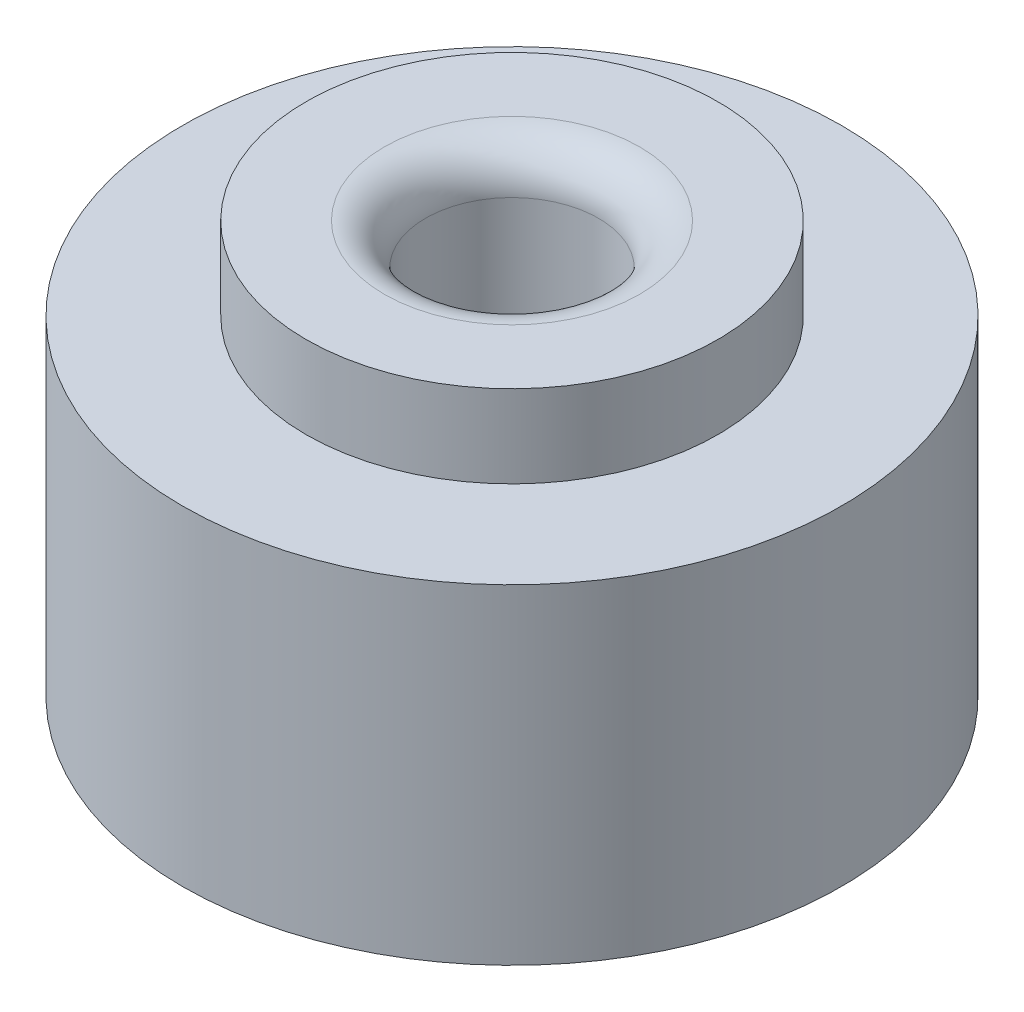
ISO-10303-21;
HEADER;
FILE_DESCRIPTION(('STEP AP214'),'2;1');
FILE_NAME('part.step','',(''),(''),'','','');
FILE_SCHEMA(('AUTOMOTIVE_DESIGN { 1 0 10303 214 1 1 1 1 }'));
ENDSEC;
DATA;
#1=APPLICATION_CONTEXT('core data for automotive mechanical design processes');
#2=APPLICATION_PROTOCOL_DEFINITION('international standard','automotive_design',2000,#1);
#3=PRODUCT_CONTEXT('',#1,'mechanical');
#4=PRODUCT('Part','Part','',(#3));
#5=PRODUCT_RELATED_PRODUCT_CATEGORY('part','',(#4));
#6=PRODUCT_DEFINITION_FORMATION('','',#4);
#7=PRODUCT_DEFINITION_CONTEXT('part definition',#1,'design');
#8=PRODUCT_DEFINITION('design','',#6,#7);
#9=PRODUCT_DEFINITION_SHAPE('','',#8);
#10=(LENGTH_UNIT() NAMED_UNIT(*) SI_UNIT(.MILLI.,.METRE.));
#11=(NAMED_UNIT(*) PLANE_ANGLE_UNIT() SI_UNIT($,.RADIAN.));
#12=(NAMED_UNIT(*) SI_UNIT($,.STERADIAN.) SOLID_ANGLE_UNIT());
#13=UNCERTAINTY_MEASURE_WITH_UNIT(LENGTH_MEASURE(1.E-05),#10,'distance_accuracy_value','');
#14=(GEOMETRIC_REPRESENTATION_CONTEXT(3) GLOBAL_UNCERTAINTY_ASSIGNED_CONTEXT((#13)) GLOBAL_UNIT_ASSIGNED_CONTEXT((#10,
#11,#12)) REPRESENTATION_CONTEXT('',''));
#15=CARTESIAN_POINT('',(0.,0.,0.));
#16=DIRECTION('',(0.,0.,1.));
#17=DIRECTION('',(1.,0.,0.));
#18=AXIS2_PLACEMENT_3D('',#15,#16,#17);
#19=CARTESIAN_POINT('',(0.,4.,0.));
#20=DIRECTION('',(0.,1.,0.));
#21=DIRECTION('',(0.,0.,1.));
#22=AXIS2_PLACEMENT_3D('',#19,#20,#21);
#23=PLANE('',#22);
#24=CARTESIAN_POINT('',(0.,4.,0.));
#25=DIRECTION('',(0.,1.,0.));
#26=DIRECTION('',(0.,0.,1.));
#27=AXIS2_PLACEMENT_3D('',#24,#25,#26);
#28=CIRCLE('',#27,2.5);
#29=CARTESIAN_POINT('',(0.,4.,2.5));
#30=VERTEX_POINT('',#29);
#31=EDGE_CURVE('E57',#30,#30,#28,.T.);
#32=ORIENTED_EDGE('',*,*,#31,.F.);
#33=EDGE_LOOP('',(#32));
#34=FACE_BOUND('',#33,.T.);
#35=CARTESIAN_POINT('',(0.,4.,0.));
#36=DIRECTION('',(0.,1.,0.));
#37=DIRECTION('',(0.,0.,1.));
#38=AXIS2_PLACEMENT_3D('',#35,#36,#37);
#39=CIRCLE('',#38,4.);
#40=CARTESIAN_POINT('',(0.,4.,4.));
#41=VERTEX_POINT('',#40);
#42=EDGE_CURVE('E50',#41,#41,#39,.T.);
#43=ORIENTED_EDGE('',*,*,#42,.T.);
#44=EDGE_LOOP('',(#43));
#45=FACE_BOUND('',#44,.T.);
#46=ADVANCED_FACE('F30',(#34,#45),#23,.T.);
#47=CARTESIAN_POINT('',(0.,0.,0.));
#48=DIRECTION('',(0.,1.,0.));
#49=DIRECTION('',(0.,0.,1.));
#50=AXIS2_PLACEMENT_3D('',#47,#48,#49);
#51=PLANE('',#50);
#52=CARTESIAN_POINT('',(0.,0.,0.));
#53=DIRECTION('',(0.,1.,0.));
#54=DIRECTION('',(0.,0.,1.));
#55=AXIS2_PLACEMENT_3D('',#52,#53,#54);
#56=CIRCLE('',#55,1.55);
#57=CARTESIAN_POINT('',(0.,0.,1.55));
#58=VERTEX_POINT('',#57);
#59=EDGE_CURVE('E45',#58,#58,#56,.T.);
#60=ORIENTED_EDGE('',*,*,#59,.T.);
#61=EDGE_LOOP('',(#60));
#62=FACE_BOUND('',#61,.T.);
#63=CARTESIAN_POINT('',(0.,0.,0.));
#64=DIRECTION('',(0.,1.,0.));
#65=DIRECTION('',(0.,0.,1.));
#66=AXIS2_PLACEMENT_3D('',#63,#64,#65);
#67=CIRCLE('',#66,4.);
#68=CARTESIAN_POINT('',(0.,0.,4.));
#69=VERTEX_POINT('',#68);
#70=EDGE_CURVE('E51',#69,#69,#67,.T.);
#71=ORIENTED_EDGE('',*,*,#70,.F.);
#72=EDGE_LOOP('',(#71));
#73=FACE_BOUND('',#72,.T.);
#74=ADVANCED_FACE('F74',(#62,#73),#51,.F.);
#75=CARTESIAN_POINT('',(0.,4.,0.));
#76=DIRECTION('',(0.,-1.,0.));
#77=DIRECTION('',(0.,0.,-1.));
#78=AXIS2_PLACEMENT_3D('',#75,#76,#77);
#79=CYLINDRICAL_SURFACE('',#78,4.);
#80=ORIENTED_EDGE('',*,*,#42,.F.);
#81=EDGE_LOOP('',(#80));
#82=FACE_BOUND('',#81,.T.);
#83=ORIENTED_EDGE('',*,*,#70,.T.);
#84=EDGE_LOOP('',(#83));
#85=FACE_BOUND('',#84,.T.);
#86=ADVANCED_FACE('F78',(#82,#85),#79,.T.);
#87=CARTESIAN_POINT('',(0.,4.,0.));
#88=DIRECTION('',(0.,-1.,0.));
#89=DIRECTION('',(0.,0.,-1.));
#90=AXIS2_PLACEMENT_3D('',#87,#88,#89);
#91=CYLINDRICAL_SURFACE('',#90,1.05);
#92=CARTESIAN_POINT('',(0.,0.5,0.));
#93=DIRECTION('',(0.,1.,0.));
#94=DIRECTION('',(0.,0.,1.));
#95=AXIS2_PLACEMENT_3D('',#92,#93,#94);
#96=CIRCLE('',#95,1.05);
#97=CARTESIAN_POINT('',(0.,0.5,1.05));
#98=VERTEX_POINT('',#97);
#99=EDGE_CURVE('E37',#98,#98,#96,.F.);
#100=ORIENTED_EDGE('',*,*,#99,.T.);
#101=EDGE_LOOP('',(#100));
#102=FACE_BOUND('',#101,.T.);
#103=CARTESIAN_POINT('',(0.,4.5,0.));
#104=DIRECTION('',(0.,1.,0.));
#105=DIRECTION('',(0.,0.,1.));
#106=AXIS2_PLACEMENT_3D('',#103,#104,#105);
#107=CIRCLE('',#106,1.05);
#108=CARTESIAN_POINT('',(0.,4.5,1.05));
#109=VERTEX_POINT('',#108);
#110=EDGE_CURVE('E41',#109,#109,#107,.T.);
#111=ORIENTED_EDGE('',*,*,#110,.T.);
#112=EDGE_LOOP('',(#111));
#113=FACE_BOUND('',#112,.T.);
#114=ADVANCED_FACE('F68',(#102,#113),#91,.F.);
#115=CARTESIAN_POINT('',(0.,5.,0.));
#116=DIRECTION('',(0.,-1.,0.));
#117=DIRECTION('',(0.,0.,-1.));
#118=AXIS2_PLACEMENT_3D('',#115,#116,#117);
#119=CYLINDRICAL_SURFACE('',#118,2.5);
#120=CARTESIAN_POINT('',(0.,5.,0.));
#121=DIRECTION('',(0.,1.,0.));
#122=DIRECTION('',(0.,0.,1.));
#123=AXIS2_PLACEMENT_3D('',#120,#121,#122);
#124=CIRCLE('',#123,2.5);
#125=CARTESIAN_POINT('',(0.,5.,2.5));
#126=VERTEX_POINT('',#125);
#127=EDGE_CURVE('E54',#126,#126,#124,.T.);
#128=ORIENTED_EDGE('',*,*,#127,.F.);
#129=EDGE_LOOP('',(#128));
#130=FACE_BOUND('',#129,.T.);
#131=ORIENTED_EDGE('',*,*,#31,.T.);
#132=EDGE_LOOP('',(#131));
#133=FACE_BOUND('',#132,.T.);
#134=ADVANCED_FACE('F65',(#130,#133),#119,.T.);
#135=CARTESIAN_POINT('',(0.,5.,0.));
#136=DIRECTION('',(0.,1.,0.));
#137=DIRECTION('',(0.,0.,1.));
#138=AXIS2_PLACEMENT_3D('',#135,#136,#137);
#139=PLANE('',#138);
#140=CARTESIAN_POINT('',(0.,5.,0.));
#141=DIRECTION('',(0.,1.,0.));
#142=DIRECTION('',(0.,0.,1.));
#143=AXIS2_PLACEMENT_3D('',#140,#141,#142);
#144=CIRCLE('',#143,1.55);
#145=CARTESIAN_POINT('',(0.,5.,1.55));
#146=VERTEX_POINT('',#145);
#147=EDGE_CURVE('E10',#146,#146,#144,.F.);
#148=ORIENTED_EDGE('',*,*,#147,.T.);
#149=EDGE_LOOP('',(#148));
#150=FACE_BOUND('',#149,.T.);
#151=ORIENTED_EDGE('',*,*,#127,.T.);
#152=EDGE_LOOP('',(#151));
#153=FACE_BOUND('',#152,.T.);
#154=ADVANCED_FACE('F63',(#150,#153),#139,.T.);
#155=CARTESIAN_POINT('',(0.,0.5,0.));
#156=DIRECTION('',(0.,1.,0.));
#157=DIRECTION('',(0.,0.,1.));
#158=AXIS2_PLACEMENT_3D('',#155,#156,#157);
#159=TOROIDAL_SURFACE('',#158,1.55,0.5);
#160=ORIENTED_EDGE('',*,*,#99,.F.);
#161=EDGE_LOOP('',(#160));
#162=FACE_BOUND('',#161,.T.);
#163=ORIENTED_EDGE('',*,*,#59,.F.);
#164=EDGE_LOOP('',(#163));
#165=FACE_BOUND('',#164,.T.);
#166=ADVANCED_FACE('F90',(#162,#165),#159,.T.);
#167=CARTESIAN_POINT('',(0.,4.5,0.));
#168=DIRECTION('',(0.,1.,0.));
#169=DIRECTION('',(0.,0.,1.));
#170=AXIS2_PLACEMENT_3D('',#167,#168,#169);
#171=TOROIDAL_SURFACE('',#170,1.55,0.5);
#172=ORIENTED_EDGE('',*,*,#147,.F.);
#173=EDGE_LOOP('',(#172));
#174=FACE_BOUND('',#173,.T.);
#175=ORIENTED_EDGE('',*,*,#110,.F.);
#176=EDGE_LOOP('',(#175));
#177=FACE_BOUND('',#176,.T.);
#178=ADVANCED_FACE('F32',(#174,#177),#171,.T.);
#179=CLOSED_SHELL('',(#46,#74,#86,#114,#134,#154,#166,#178));
#180=MANIFOLD_SOLID_BREP('B2',#179);
#181=ADVANCED_BREP_SHAPE_REPRESENTATION('',(#18,#180),#14);
#182=SHAPE_DEFINITION_REPRESENTATION(#9,#181);
ENDSEC;
END-ISO-10303-21;
